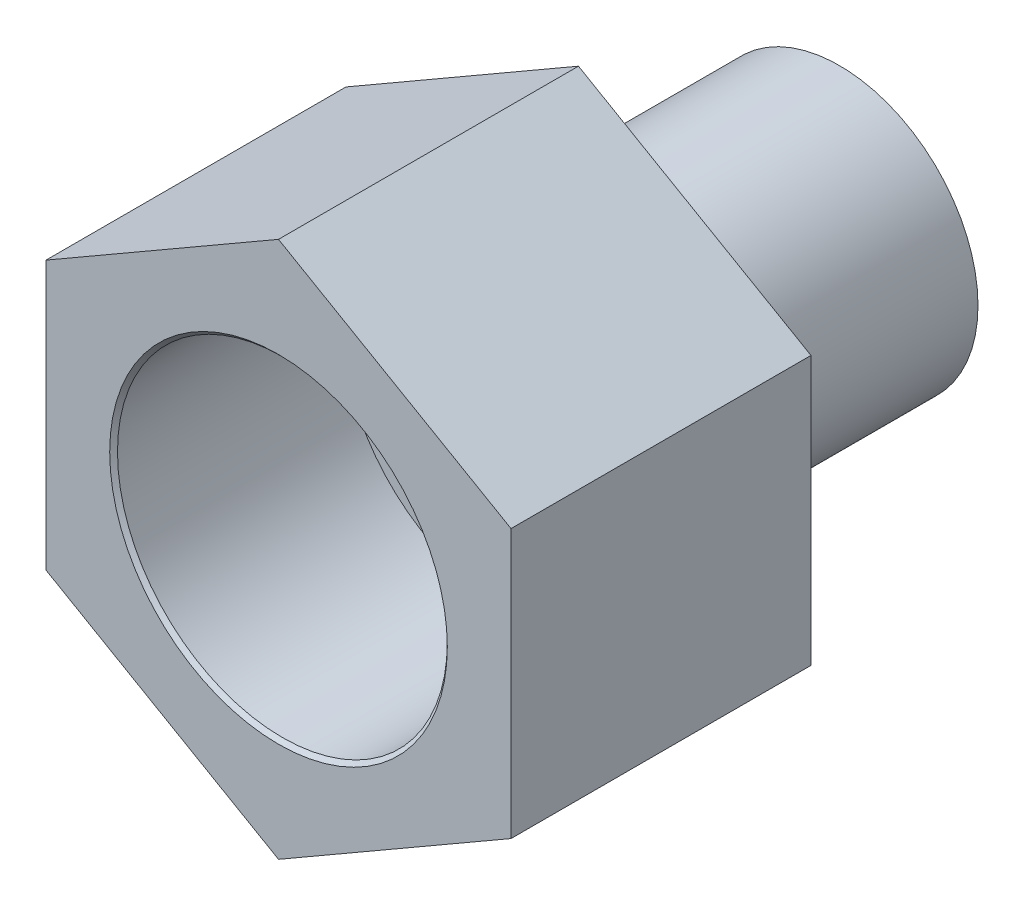
ISO-10303-21;
HEADER;
FILE_DESCRIPTION(('STEP AP214'),'2;1');
FILE_NAME('part.step','',(''),(''),'','','');
FILE_SCHEMA(('AUTOMOTIVE_DESIGN { 1 0 10303 214 1 1 1 1 }'));
ENDSEC;
DATA;
#1=APPLICATION_CONTEXT('core data for automotive mechanical design processes');
#2=APPLICATION_PROTOCOL_DEFINITION('international standard','automotive_design',2000,#1);
#3=PRODUCT_CONTEXT('',#1,'mechanical');
#4=PRODUCT('Part','Part','',(#3));
#5=PRODUCT_RELATED_PRODUCT_CATEGORY('part','',(#4));
#6=PRODUCT_DEFINITION_FORMATION('','',#4);
#7=PRODUCT_DEFINITION_CONTEXT('part definition',#1,'design');
#8=PRODUCT_DEFINITION('design','',#6,#7);
#9=PRODUCT_DEFINITION_SHAPE('','',#8);
#10=(LENGTH_UNIT() NAMED_UNIT(*) SI_UNIT(.MILLI.,.METRE.));
#11=(NAMED_UNIT(*) PLANE_ANGLE_UNIT() SI_UNIT($,.RADIAN.));
#12=(NAMED_UNIT(*) SI_UNIT($,.STERADIAN.) SOLID_ANGLE_UNIT());
#13=UNCERTAINTY_MEASURE_WITH_UNIT(LENGTH_MEASURE(1.E-05),#10,'distance_accuracy_value','');
#14=(GEOMETRIC_REPRESENTATION_CONTEXT(3) GLOBAL_UNCERTAINTY_ASSIGNED_CONTEXT((#13)) GLOBAL_UNIT_ASSIGNED_CONTEXT((#10,
#11,#12)) REPRESENTATION_CONTEXT('',''));
#15=CARTESIAN_POINT('',(0.,0.,0.));
#16=DIRECTION('',(0.,0.,1.));
#17=DIRECTION('',(1.,0.,0.));
#18=AXIS2_PLACEMENT_3D('',#15,#16,#17);
#19=CARTESIAN_POINT('',(0.,0.,-43.2));
#20=DIRECTION('',(0.,0.,1.));
#21=DIRECTION('',(1.,0.,0.));
#22=AXIS2_PLACEMENT_3D('',#19,#20,#21);
#23=PLANE('',#22);
#24=CARTESIAN_POINT('',(0.,0.,-43.2));
#25=DIRECTION('',(0.,0.,1.));
#26=DIRECTION('',(1.,0.,0.));
#27=AXIS2_PLACEMENT_3D('',#24,#25,#26);
#28=CIRCLE('',#27,6.35);
#29=CARTESIAN_POINT('',(6.35,0.,-43.2));
#30=VERTEX_POINT('',#29);
#31=EDGE_CURVE('E179',#30,#30,#28,.T.);
#32=ORIENTED_EDGE('',*,*,#31,.T.);
#33=EDGE_LOOP('',(#32));
#34=FACE_BOUND('',#33,.T.);
#35=CARTESIAN_POINT('',(0.,0.,-43.2));
#36=DIRECTION('',(0.,0.,-1.));
#37=DIRECTION('',(-1.,0.,0.));
#38=AXIS2_PLACEMENT_3D('',#35,#36,#37);
#39=CIRCLE('',#38,10.668);
#40=CARTESIAN_POINT('',(-10.668,0.,-43.2));
#41=VERTEX_POINT('',#40);
#42=EDGE_CURVE('E186',#41,#41,#39,.T.);
#43=ORIENTED_EDGE('',*,*,#42,.T.);
#44=EDGE_LOOP('',(#43));
#45=FACE_BOUND('',#44,.T.);
#46=ADVANCED_FACE('F63',(#34,#45),#23,.F.);
#47=CARTESIAN_POINT('',(0.,0.,0.));
#48=DIRECTION('',(0.,0.,1.));
#49=DIRECTION('',(1.,0.,0.));
#50=AXIS2_PLACEMENT_3D('',#47,#48,#49);
#51=PLANE('',#50);
#52=CARTESIAN_POINT('',(0.,0.,0.));
#53=DIRECTION('',(0.,0.,1.));
#54=DIRECTION('',(1.,0.,0.));
#55=AXIS2_PLACEMENT_3D('',#52,#53,#54);
#56=CIRCLE('',#55,13.);
#57=CARTESIAN_POINT('',(13.,0.,0.));
#58=VERTEX_POINT('',#57);
#59=EDGE_CURVE('E176',#58,#58,#56,.T.);
#60=ORIENTED_EDGE('',*,*,#59,.F.);
#61=EDGE_LOOP('',(#60));
#62=FACE_BOUND('',#61,.T.);
#63=DIRECTION('',(0.866025403784442,-0.499999999999995,0.));
#64=VECTOR('',#63,1.);
#65=CARTESIAN_POINT('',(-8.95253761162154,-15.50625,0.));
#66=LINE('',#65,#64);
#67=CARTESIAN_POINT('',(-17.9050752232432,-10.3375000000001,0.));
#68=VERTEX_POINT('',#67);
#69=CARTESIAN_POINT('',(1.56125112837913E-13,-20.675,0.));
#70=VERTEX_POINT('',#69);
#71=EDGE_CURVE('E143',#68,#70,#66,.T.);
#72=ORIENTED_EDGE('',*,*,#71,.T.);
#73=DIRECTION('',(0.866025403784435,0.500000000000007,0.));
#74=VECTOR('',#73,1.);
#75=CARTESIAN_POINT('',(8.95253761162176,-15.5062499999999,0.));
#76=LINE('',#75,#74);
#77=CARTESIAN_POINT('',(17.9050752232434,-10.3374999999998,0.));
#78=VERTEX_POINT('',#77);
#79=EDGE_CURVE('E80',#70,#78,#76,.T.);
#80=ORIENTED_EDGE('',*,*,#79,.T.);
#81=DIRECTION('',(0.,1.,0.));
#82=VECTOR('',#81,1.);
#83=CARTESIAN_POINT('',(17.9050752232433,1.86287010243407E-13,0.));
#84=LINE('',#83,#82);
#85=CARTESIAN_POINT('',(17.9050752232432,10.3375000000002,0.));
#86=VERTEX_POINT('',#85);
#87=EDGE_CURVE('E67',#78,#86,#84,.T.);
#88=ORIENTED_EDGE('',*,*,#87,.T.);
#89=DIRECTION('',(-0.866025403784442,0.499999999999995,0.));
#90=VECTOR('',#89,1.);
#91=CARTESIAN_POINT('',(8.95253761162158,15.5062500000001,0.));
#92=LINE('',#91,#90);
#93=CARTESIAN_POINT('',(0.,20.675,0.));
#94=VERTEX_POINT('',#93);
#95=EDGE_CURVE('E159',#86,#94,#92,.T.);
#96=ORIENTED_EDGE('',*,*,#95,.T.);
#97=DIRECTION('',(-0.866025403784438,-0.500000000000001,0.));
#98=VECTOR('',#97,1.);
#99=CARTESIAN_POINT('',(-8.95253761162165,15.50625,0.));
#100=LINE('',#99,#98);
#101=CARTESIAN_POINT('',(-17.9050752232433,10.3375,0.));
#102=VERTEX_POINT('',#101);
#103=EDGE_CURVE('E134',#94,#102,#100,.T.);
#104=ORIENTED_EDGE('',*,*,#103,.T.);
#105=DIRECTION('',(0.,-1.,0.));
#106=VECTOR('',#105,1.);
#107=CARTESIAN_POINT('',(-17.9050752232433,0.,0.));
#108=LINE('',#107,#106);
#109=EDGE_CURVE('E88',#102,#68,#108,.T.);
#110=ORIENTED_EDGE('',*,*,#109,.T.);
#111=EDGE_LOOP('',(#72,#80,#88,#96,#104,#110));
#112=FACE_BOUND('',#111,.T.);
#113=ADVANCED_FACE('F65',(#62,#112),#51,.T.);
#114=CARTESIAN_POINT('',(17.9050752232433,1.86287010243407E-13,-23.1));
#115=DIRECTION('',(1.,0.,0.));
#116=DIRECTION('',(0.,1.,0.));
#117=AXIS2_PLACEMENT_3D('',#114,#115,#116);
#118=PLANE('',#117);
#119=ORIENTED_EDGE('',*,*,#87,.F.);
#120=DIRECTION('',(0.,0.,1.));
#121=VECTOR('',#120,1.);
#122=CARTESIAN_POINT('',(17.9050752232434,-10.3374999999998,-23.1));
#123=LINE('',#122,#121);
#124=CARTESIAN_POINT('',(17.9050752232434,-10.3374999999998,-23.1));
#125=VERTEX_POINT('',#124);
#126=EDGE_CURVE('E162',#125,#78,#123,.T.);
#127=ORIENTED_EDGE('',*,*,#126,.F.);
#128=DIRECTION('',(0.,1.,0.));
#129=VECTOR('',#128,1.);
#130=CARTESIAN_POINT('',(17.9050752232433,1.86287010243407E-13,-23.1));
#131=LINE('',#130,#129);
#132=CARTESIAN_POINT('',(17.9050752232431,10.3375000000002,-23.1));
#133=VERTEX_POINT('',#132);
#134=EDGE_CURVE('E146',#125,#133,#131,.T.);
#135=ORIENTED_EDGE('',*,*,#134,.T.);
#136=DIRECTION('',(0.,0.,1.));
#137=VECTOR('',#136,1.);
#138=CARTESIAN_POINT('',(17.9050752232432,10.3375000000002,-23.1));
#139=LINE('',#138,#137);
#140=EDGE_CURVE('E152',#133,#86,#139,.T.);
#141=ORIENTED_EDGE('',*,*,#140,.T.);
#142=EDGE_LOOP('',(#119,#127,#135,#141));
#143=FACE_BOUND('',#142,.T.);
#144=ADVANCED_FACE('F207',(#143),#118,.T.);
#145=CARTESIAN_POINT('',(-8.95253761162154,-15.50625,-23.1));
#146=DIRECTION('',(-0.499999999999995,-0.866025403784442,0.));
#147=DIRECTION('',(0.866025403784441,-0.499999999999995,0.));
#148=AXIS2_PLACEMENT_3D('',#145,#146,#147);
#149=PLANE('',#148);
#150=ORIENTED_EDGE('',*,*,#71,.F.);
#151=DIRECTION('',(0.,0.,1.));
#152=VECTOR('',#151,1.);
#153=CARTESIAN_POINT('',(-17.9050752232432,-10.3375000000001,-23.1));
#154=LINE('',#153,#152);
#155=CARTESIAN_POINT('',(-17.9050752232432,-10.3375000000001,-23.1));
#156=VERTEX_POINT('',#155);
#157=EDGE_CURVE('E126',#156,#68,#154,.T.);
#158=ORIENTED_EDGE('',*,*,#157,.F.);
#159=DIRECTION('',(0.866025403784442,-0.499999999999995,0.));
#160=VECTOR('',#159,1.);
#161=CARTESIAN_POINT('',(-8.95253761162154,-15.50625,-23.1));
#162=LINE('',#161,#160);
#163=CARTESIAN_POINT('',(1.40512601554121E-13,-20.675,-23.1));
#164=VERTEX_POINT('',#163);
#165=EDGE_CURVE('E124',#156,#164,#162,.T.);
#166=ORIENTED_EDGE('',*,*,#165,.T.);
#167=DIRECTION('',(0.,0.,1.));
#168=VECTOR('',#167,1.);
#169=CARTESIAN_POINT('',(1.56125112837913E-13,-20.675,-23.1));
#170=LINE('',#169,#168);
#171=EDGE_CURVE('E137',#164,#70,#170,.T.);
#172=ORIENTED_EDGE('',*,*,#171,.T.);
#173=EDGE_LOOP('',(#150,#158,#166,#172));
#174=FACE_BOUND('',#173,.T.);
#175=ADVANCED_FACE('F213',(#174),#149,.T.);
#176=CARTESIAN_POINT('',(-8.95253761162165,15.50625,-23.1));
#177=DIRECTION('',(-0.500000000000001,0.866025403784438,0.));
#178=DIRECTION('',(-0.866025403784438,-0.500000000000001,0.));
#179=AXIS2_PLACEMENT_3D('',#176,#177,#178);
#180=PLANE('',#179);
#181=ORIENTED_EDGE('',*,*,#103,.F.);
#182=DIRECTION('',(0.,0.,1.));
#183=VECTOR('',#182,1.);
#184=CARTESIAN_POINT('',(0.,20.675,-23.1));
#185=LINE('',#184,#183);
#186=CARTESIAN_POINT('',(0.,20.675,-23.1));
#187=VERTEX_POINT('',#186);
#188=EDGE_CURVE('E72',#187,#94,#185,.T.);
#189=ORIENTED_EDGE('',*,*,#188,.F.);
#190=DIRECTION('',(-0.866025403784438,-0.500000000000001,0.));
#191=VECTOR('',#190,1.);
#192=CARTESIAN_POINT('',(-8.95253761162165,15.50625,-23.1));
#193=LINE('',#192,#191);
#194=CARTESIAN_POINT('',(-17.9050752232433,10.3375,-23.1));
#195=VERTEX_POINT('',#194);
#196=EDGE_CURVE('E121',#187,#195,#193,.T.);
#197=ORIENTED_EDGE('',*,*,#196,.T.);
#198=DIRECTION('',(0.,0.,1.));
#199=VECTOR('',#198,1.);
#200=CARTESIAN_POINT('',(-17.9050752232433,10.3375,-23.1));
#201=LINE('',#200,#199);
#202=EDGE_CURVE('E12',#195,#102,#201,.T.);
#203=ORIENTED_EDGE('',*,*,#202,.T.);
#204=EDGE_LOOP('',(#181,#189,#197,#203));
#205=FACE_BOUND('',#204,.T.);
#206=ADVANCED_FACE('F133',(#205),#180,.T.);
#207=CARTESIAN_POINT('',(-17.9050752232433,0.,-23.1));
#208=DIRECTION('',(-1.,0.,0.));
#209=DIRECTION('',(0.,-1.,0.));
#210=AXIS2_PLACEMENT_3D('',#207,#208,#209);
#211=PLANE('',#210);
#212=ORIENTED_EDGE('',*,*,#109,.F.);
#213=ORIENTED_EDGE('',*,*,#202,.F.);
#214=DIRECTION('',(0.,-1.,0.));
#215=VECTOR('',#214,1.);
#216=CARTESIAN_POINT('',(-17.9050752232433,0.,-23.1));
#217=LINE('',#216,#215);
#218=EDGE_CURVE('E118',#195,#156,#217,.T.);
#219=ORIENTED_EDGE('',*,*,#218,.T.);
#220=ORIENTED_EDGE('',*,*,#157,.T.);
#221=EDGE_LOOP('',(#212,#213,#219,#220));
#222=FACE_BOUND('',#221,.T.);
#223=ADVANCED_FACE('F128',(#222),#211,.T.);
#224=CARTESIAN_POINT('',(8.95253761162158,15.5062500000001,-23.1));
#225=DIRECTION('',(0.499999999999995,0.866025403784441,0.));
#226=DIRECTION('',(-0.866025403784442,0.499999999999995,0.));
#227=AXIS2_PLACEMENT_3D('',#224,#225,#226);
#228=PLANE('',#227);
#229=ORIENTED_EDGE('',*,*,#95,.F.);
#230=ORIENTED_EDGE('',*,*,#140,.F.);
#231=DIRECTION('',(-0.866025403784442,0.499999999999995,0.));
#232=VECTOR('',#231,1.);
#233=CARTESIAN_POINT('',(8.95253761162158,15.5062500000001,-23.1));
#234=LINE('',#233,#232);
#235=EDGE_CURVE('E156',#133,#187,#234,.T.);
#236=ORIENTED_EDGE('',*,*,#235,.T.);
#237=ORIENTED_EDGE('',*,*,#188,.T.);
#238=EDGE_LOOP('',(#229,#230,#236,#237));
#239=FACE_BOUND('',#238,.T.);
#240=ADVANCED_FACE('F221',(#239),#228,.T.);
#241=CARTESIAN_POINT('',(8.95253761162176,-15.5062499999999,-23.1));
#242=DIRECTION('',(0.500000000000007,-0.866025403784434,0.));
#243=DIRECTION('',(0.866025403784435,0.500000000000007,0.));
#244=AXIS2_PLACEMENT_3D('',#241,#242,#243);
#245=PLANE('',#244);
#246=ORIENTED_EDGE('',*,*,#79,.F.);
#247=ORIENTED_EDGE('',*,*,#171,.F.);
#248=DIRECTION('',(0.866025403784435,0.500000000000007,0.));
#249=VECTOR('',#248,1.);
#250=CARTESIAN_POINT('',(8.95253761162176,-15.5062499999999,-23.1));
#251=LINE('',#250,#249);
#252=EDGE_CURVE('E164',#164,#125,#251,.T.);
#253=ORIENTED_EDGE('',*,*,#252,.T.);
#254=ORIENTED_EDGE('',*,*,#126,.T.);
#255=EDGE_LOOP('',(#246,#247,#253,#254));
#256=FACE_BOUND('',#255,.T.);
#257=ADVANCED_FACE('F224',(#256),#245,.T.);
#258=CARTESIAN_POINT('',(0.,0.,-17.6));
#259=DIRECTION('',(0.,0.,-1.));
#260=DIRECTION('',(-1.,0.,0.));
#261=AXIS2_PLACEMENT_3D('',#258,#259,#260);
#262=PLANE('',#261);
#263=CARTESIAN_POINT('',(0.,0.,-17.6));
#264=DIRECTION('',(0.,0.,1.));
#265=DIRECTION('',(1.,0.,0.));
#266=AXIS2_PLACEMENT_3D('',#263,#264,#265);
#267=CIRCLE('',#266,6.34999999999999);
#268=CARTESIAN_POINT('',(6.34999999999999,0.,-17.6));
#269=VERTEX_POINT('',#268);
#270=EDGE_CURVE('E182',#269,#269,#267,.T.);
#271=ORIENTED_EDGE('',*,*,#270,.F.);
#272=EDGE_LOOP('',(#271));
#273=FACE_BOUND('',#272,.T.);
#274=CARTESIAN_POINT('',(0.,0.,-17.6));
#275=DIRECTION('',(0.,0.,1.));
#276=DIRECTION('',(1.,0.,0.));
#277=AXIS2_PLACEMENT_3D('',#274,#275,#276);
#278=CIRCLE('',#277,12.7);
#279=CARTESIAN_POINT('',(12.7,0.,-17.6));
#280=VERTEX_POINT('',#279);
#281=EDGE_CURVE('E169',#280,#280,#278,.T.);
#282=ORIENTED_EDGE('',*,*,#281,.T.);
#283=EDGE_LOOP('',(#282));
#284=FACE_BOUND('',#283,.T.);
#285=ADVANCED_FACE('F228',(#273,#284),#262,.F.);
#286=CARTESIAN_POINT('',(0.,0.,0.));
#287=DIRECTION('',(0.,0.,1.));
#288=DIRECTION('',(1.,0.,0.));
#289=AXIS2_PLACEMENT_3D('',#286,#287,#288);
#290=CYLINDRICAL_SURFACE('',#289,12.7);
#291=ORIENTED_EDGE('',*,*,#281,.F.);
#292=EDGE_LOOP('',(#291));
#293=FACE_BOUND('',#292,.T.);
#294=CARTESIAN_POINT('',(0.,0.,-0.300000000000016));
#295=DIRECTION('',(0.,0.,1.));
#296=DIRECTION('',(1.,0.,0.));
#297=AXIS2_PLACEMENT_3D('',#294,#295,#296);
#298=CIRCLE('',#297,12.7);
#299=CARTESIAN_POINT('',(12.7,0.,-0.300000000000016));
#300=VERTEX_POINT('',#299);
#301=EDGE_CURVE('E173',#300,#300,#298,.T.);
#302=ORIENTED_EDGE('',*,*,#301,.T.);
#303=EDGE_LOOP('',(#302));
#304=FACE_BOUND('',#303,.T.);
#305=ADVANCED_FACE('F231',(#293,#304),#290,.F.);
#306=CARTESIAN_POINT('',(0.,0.,0.));
#307=DIRECTION('',(0.,0.,1.));
#308=DIRECTION('',(1.,0.,0.));
#309=AXIS2_PLACEMENT_3D('',#306,#307,#308);
#310=CONICAL_SURFACE('',#309,13.,0.785398163397463);
#311=ORIENTED_EDGE('',*,*,#301,.F.);
#312=EDGE_LOOP('',(#311));
#313=FACE_BOUND('',#312,.T.);
#314=ORIENTED_EDGE('',*,*,#59,.T.);
#315=EDGE_LOOP('',(#314));
#316=FACE_BOUND('',#315,.T.);
#317=ADVANCED_FACE('F235',(#313,#316),#310,.F.);
#318=CARTESIAN_POINT('',(0.,0.,-17.6));
#319=DIRECTION('',(0.,0.,1.));
#320=DIRECTION('',(1.,0.,0.));
#321=AXIS2_PLACEMENT_3D('',#318,#319,#320);
#322=CYLINDRICAL_SURFACE('',#321,6.34999999999999);
#323=ORIENTED_EDGE('',*,*,#31,.F.);
#324=EDGE_LOOP('',(#323));
#325=FACE_BOUND('',#324,.T.);
#326=ORIENTED_EDGE('',*,*,#270,.T.);
#327=EDGE_LOOP('',(#326));
#328=FACE_BOUND('',#327,.T.);
#329=ADVANCED_FACE('F200',(#325,#328),#322,.F.);
#330=CARTESIAN_POINT('',(0.,0.,-23.1));
#331=DIRECTION('',(0.,0.,-1.));
#332=DIRECTION('',(-1.,0.,0.));
#333=AXIS2_PLACEMENT_3D('',#330,#331,#332);
#334=CYLINDRICAL_SURFACE('',#333,10.668);
#335=CARTESIAN_POINT('',(0.,0.,-23.1));
#336=DIRECTION('',(0.,0.,-1.));
#337=DIRECTION('',(-1.,0.,0.));
#338=AXIS2_PLACEMENT_3D('',#335,#336,#337);
#339=CIRCLE('',#338,10.668);
#340=CARTESIAN_POINT('',(-10.668,0.,-23.1));
#341=VERTEX_POINT('',#340);
#342=EDGE_CURVE('E185',#341,#341,#339,.T.);
#343=ORIENTED_EDGE('',*,*,#342,.T.);
#344=EDGE_LOOP('',(#343));
#345=FACE_BOUND('',#344,.T.);
#346=ORIENTED_EDGE('',*,*,#42,.F.);
#347=EDGE_LOOP('',(#346));
#348=FACE_BOUND('',#347,.T.);
#349=ADVANCED_FACE('F192',(#345,#348),#334,.T.);
#350=CARTESIAN_POINT('',(0.,0.,-23.1));
#351=DIRECTION('',(0.,0.,-1.));
#352=DIRECTION('',(-1.,0.,0.));
#353=AXIS2_PLACEMENT_3D('',#350,#351,#352);
#354=PLANE('',#353);
#355=ORIENTED_EDGE('',*,*,#342,.F.);
#356=EDGE_LOOP('',(#355));
#357=FACE_BOUND('',#356,.T.);
#358=ORIENTED_EDGE('',*,*,#235,.F.);
#359=ORIENTED_EDGE('',*,*,#134,.F.);
#360=ORIENTED_EDGE('',*,*,#252,.F.);
#361=ORIENTED_EDGE('',*,*,#165,.F.);
#362=ORIENTED_EDGE('',*,*,#218,.F.);
#363=ORIENTED_EDGE('',*,*,#196,.F.);
#364=EDGE_LOOP('',(#358,#359,#360,#361,#362,#363));
#365=FACE_BOUND('',#364,.T.);
#366=ADVANCED_FACE('F119',(#357,#365),#354,.T.);
#367=CLOSED_SHELL('',(#46,#113,#144,#175,#206,#223,#240,#257,#285,#305,#317,#329,#349,#366));
#368=MANIFOLD_SOLID_BREP('B2',#367);
#369=ADVANCED_BREP_SHAPE_REPRESENTATION('',(#18,#368),#14);
#370=SHAPE_DEFINITION_REPRESENTATION(#9,#369);
ENDSEC;
END-ISO-10303-21;
